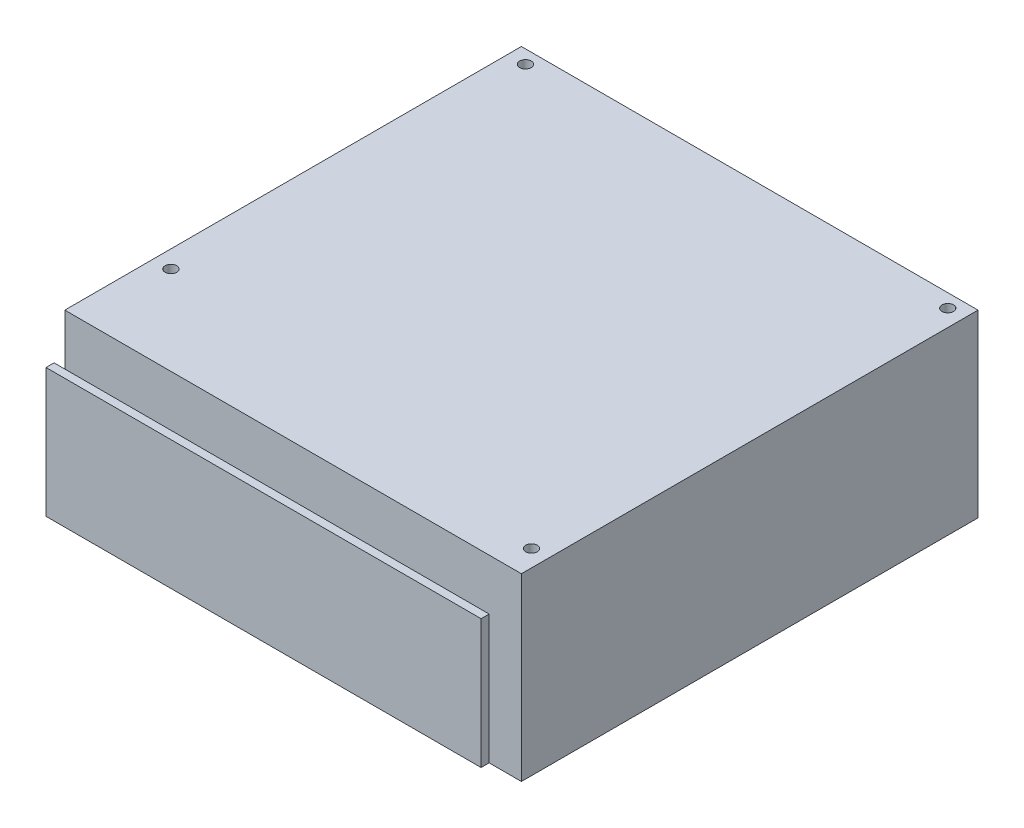
ISO-10303-21;
HEADER;
FILE_DESCRIPTION(('STEP AP214'),'2;1');
FILE_NAME('part.step','',(''),(''),'','','');
FILE_SCHEMA(('AUTOMOTIVE_DESIGN { 1 0 10303 214 1 1 1 1 }'));
ENDSEC;
DATA;
#1=APPLICATION_CONTEXT('core data for automotive mechanical design processes');
#2=APPLICATION_PROTOCOL_DEFINITION('international standard','automotive_design',2000,#1);
#3=PRODUCT_CONTEXT('',#1,'mechanical');
#4=PRODUCT('Part','Part','',(#3));
#5=PRODUCT_RELATED_PRODUCT_CATEGORY('part','',(#4));
#6=PRODUCT_DEFINITION_FORMATION('','',#4);
#7=PRODUCT_DEFINITION_CONTEXT('part definition',#1,'design');
#8=PRODUCT_DEFINITION('design','',#6,#7);
#9=PRODUCT_DEFINITION_SHAPE('','',#8);
#10=(LENGTH_UNIT() NAMED_UNIT(*) SI_UNIT(.MILLI.,.METRE.));
#11=(NAMED_UNIT(*) PLANE_ANGLE_UNIT() SI_UNIT($,.RADIAN.));
#12=(NAMED_UNIT(*) SI_UNIT($,.STERADIAN.) SOLID_ANGLE_UNIT());
#13=UNCERTAINTY_MEASURE_WITH_UNIT(LENGTH_MEASURE(1.E-05),#10,'distance_accuracy_value','');
#14=(GEOMETRIC_REPRESENTATION_CONTEXT(3) GLOBAL_UNCERTAINTY_ASSIGNED_CONTEXT((#13)) GLOBAL_UNIT_ASSIGNED_CONTEXT((#10,
#11,#12)) REPRESENTATION_CONTEXT('',''));
#15=CARTESIAN_POINT('',(0.,0.,0.));
#16=DIRECTION('',(0.,0.,1.));
#17=DIRECTION('',(1.,0.,0.));
#18=AXIS2_PLACEMENT_3D('',#15,#16,#17);
#19=CARTESIAN_POINT('',(-85.,67.,85.));
#20=DIRECTION('',(0.,0.,-1.));
#21=DIRECTION('',(-1.,0.,0.));
#22=AXIS2_PLACEMENT_3D('',#19,#20,#21);
#23=PLANE('',#22);
#24=DIRECTION('',(0.,1.,0.));
#25=VECTOR('',#24,1.);
#26=CARTESIAN_POINT('',(73.,0.,85.));
#27=LINE('',#26,#25);
#28=CARTESIAN_POINT('',(73.,0.,85.));
#29=VERTEX_POINT('',#28);
#30=CARTESIAN_POINT('',(73.,48.,85.));
#31=VERTEX_POINT('',#30);
#32=EDGE_CURVE('E59',#29,#31,#27,.T.);
#33=ORIENTED_EDGE('',*,*,#32,.F.);
#34=DIRECTION('',(1.,0.,0.));
#35=VECTOR('',#34,1.);
#36=CARTESIAN_POINT('',(-85.,0.,85.));
#37=LINE('',#36,#35);
#38=CARTESIAN_POINT('',(85.,0.,85.));
#39=VERTEX_POINT('',#38);
#40=EDGE_CURVE('E140',#29,#39,#37,.T.);
#41=ORIENTED_EDGE('',*,*,#40,.T.);
#42=DIRECTION('',(0.,-1.,0.));
#43=VECTOR('',#42,1.);
#44=CARTESIAN_POINT('',(85.,67.,85.));
#45=LINE('',#44,#43);
#46=CARTESIAN_POINT('',(85.,67.,85.));
#47=VERTEX_POINT('',#46);
#48=EDGE_CURVE('E145',#47,#39,#45,.T.);
#49=ORIENTED_EDGE('',*,*,#48,.F.);
#50=DIRECTION('',(1.,0.,0.));
#51=VECTOR('',#50,1.);
#52=CARTESIAN_POINT('',(-85.,67.,85.));
#53=LINE('',#52,#51);
#54=CARTESIAN_POINT('',(-85.,67.,85.));
#55=VERTEX_POINT('',#54);
#56=EDGE_CURVE('E144',#55,#47,#53,.T.);
#57=ORIENTED_EDGE('',*,*,#56,.F.);
#58=DIRECTION('',(0.,-1.,0.));
#59=VECTOR('',#58,1.);
#60=CARTESIAN_POINT('',(-85.,67.,85.));
#61=LINE('',#60,#59);
#62=CARTESIAN_POINT('',(-85.,48.,85.));
#63=VERTEX_POINT('',#62);
#64=EDGE_CURVE('E154',#55,#63,#61,.T.);
#65=ORIENTED_EDGE('',*,*,#64,.T.);
#66=DIRECTION('',(-1.,0.,0.));
#67=VECTOR('',#66,1.);
#68=CARTESIAN_POINT('',(73.,48.,85.));
#69=LINE('',#68,#67);
#70=EDGE_CURVE('E54',#31,#63,#69,.T.);
#71=ORIENTED_EDGE('',*,*,#70,.F.);
#72=EDGE_LOOP('',(#33,#41,#49,#57,#65,#71));
#73=FACE_BOUND('',#72,.T.);
#74=ADVANCED_FACE('F39',(#73),#23,.F.);
#75=CARTESIAN_POINT('',(85.,67.,85.));
#76=DIRECTION('',(-1.,0.,0.));
#77=DIRECTION('',(0.,0.,1.));
#78=AXIS2_PLACEMENT_3D('',#75,#76,#77);
#79=PLANE('',#78);
#80=DIRECTION('',(0.,0.,-1.));
#81=VECTOR('',#80,1.);
#82=CARTESIAN_POINT('',(85.,0.,85.));
#83=LINE('',#82,#81);
#84=CARTESIAN_POINT('',(85.,0.,-85.));
#85=VERTEX_POINT('',#84);
#86=EDGE_CURVE('E127',#39,#85,#83,.T.);
#87=ORIENTED_EDGE('',*,*,#86,.T.);
#88=DIRECTION('',(0.,-1.,0.));
#89=VECTOR('',#88,1.);
#90=CARTESIAN_POINT('',(85.,67.,-85.));
#91=LINE('',#90,#89);
#92=CARTESIAN_POINT('',(85.,67.,-85.));
#93=VERTEX_POINT('',#92);
#94=EDGE_CURVE('E11',#93,#85,#91,.T.);
#95=ORIENTED_EDGE('',*,*,#94,.F.);
#96=DIRECTION('',(0.,0.,-1.));
#97=VECTOR('',#96,1.);
#98=CARTESIAN_POINT('',(85.,67.,85.));
#99=LINE('',#98,#97);
#100=EDGE_CURVE('E136',#47,#93,#99,.T.);
#101=ORIENTED_EDGE('',*,*,#100,.F.);
#102=ORIENTED_EDGE('',*,*,#48,.T.);
#103=EDGE_LOOP('',(#87,#95,#101,#102));
#104=FACE_BOUND('',#103,.T.);
#105=ADVANCED_FACE('F41',(#104),#79,.F.);
#106=CARTESIAN_POINT('',(-85.,67.,-85.));
#107=DIRECTION('',(0.,0.,1.));
#108=DIRECTION('',(1.,0.,0.));
#109=AXIS2_PLACEMENT_3D('',#106,#107,#108);
#110=PLANE('',#109);
#111=DIRECTION('',(-1.,0.,0.));
#112=VECTOR('',#111,1.);
#113=CARTESIAN_POINT('',(-85.,0.,-85.));
#114=LINE('',#113,#112);
#115=CARTESIAN_POINT('',(-85.,0.,-85.));
#116=VERTEX_POINT('',#115);
#117=EDGE_CURVE('E130',#85,#116,#114,.T.);
#118=ORIENTED_EDGE('',*,*,#117,.T.);
#119=DIRECTION('',(0.,-1.,0.));
#120=VECTOR('',#119,1.);
#121=CARTESIAN_POINT('',(-85.,67.,-85.));
#122=LINE('',#121,#120);
#123=CARTESIAN_POINT('',(-85.,67.,-85.));
#124=VERTEX_POINT('',#123);
#125=EDGE_CURVE('E47',#124,#116,#122,.T.);
#126=ORIENTED_EDGE('',*,*,#125,.F.);
#127=DIRECTION('',(-1.,0.,0.));
#128=VECTOR('',#127,1.);
#129=CARTESIAN_POINT('',(-85.,67.,-85.));
#130=LINE('',#129,#128);
#131=EDGE_CURVE('E139',#93,#124,#130,.T.);
#132=ORIENTED_EDGE('',*,*,#131,.F.);
#133=ORIENTED_EDGE('',*,*,#94,.T.);
#134=EDGE_LOOP('',(#118,#126,#132,#133));
#135=FACE_BOUND('',#134,.T.);
#136=ADVANCED_FACE('F208',(#135),#110,.F.);
#137=CARTESIAN_POINT('',(-85.,67.,85.));
#138=DIRECTION('',(1.,0.,0.));
#139=DIRECTION('',(0.,0.,-1.));
#140=AXIS2_PLACEMENT_3D('',#137,#138,#139);
#141=PLANE('',#140);
#142=DIRECTION('',(0.,0.,1.));
#143=VECTOR('',#142,1.);
#144=CARTESIAN_POINT('',(-85.,0.,85.));
#145=LINE('',#144,#143);
#146=CARTESIAN_POINT('',(-85.,0.,85.));
#147=VERTEX_POINT('',#146);
#148=EDGE_CURVE('E148',#116,#147,#145,.T.);
#149=ORIENTED_EDGE('',*,*,#148,.T.);
#150=EDGE_CURVE('E153',#63,#147,#61,.T.);
#151=ORIENTED_EDGE('',*,*,#150,.F.);
#152=ORIENTED_EDGE('',*,*,#64,.F.);
#153=DIRECTION('',(0.,0.,1.));
#154=VECTOR('',#153,1.);
#155=CARTESIAN_POINT('',(-85.,67.,85.));
#156=LINE('',#155,#154);
#157=EDGE_CURVE('E142',#124,#55,#156,.T.);
#158=ORIENTED_EDGE('',*,*,#157,.F.);
#159=ORIENTED_EDGE('',*,*,#125,.T.);
#160=EDGE_LOOP('',(#149,#151,#152,#158,#159));
#161=FACE_BOUND('',#160,.T.);
#162=ADVANCED_FACE('F160',(#161),#141,.F.);
#163=CARTESIAN_POINT('',(0.,67.,0.));
#164=DIRECTION('',(0.,-1.,0.));
#165=DIRECTION('',(0.,0.,-1.));
#166=AXIS2_PLACEMENT_3D('',#163,#164,#165);
#167=PLANE('',#166);
#168=CARTESIAN_POINT('',(-78.5,67.,-80.));
#169=DIRECTION('',(0.,1.,0.));
#170=DIRECTION('',(0.,0.,1.));
#171=AXIS2_PLACEMENT_3D('',#168,#169,#170);
#172=CIRCLE('',#171,2.15);
#173=CARTESIAN_POINT('',(-78.5,67.,-77.85));
#174=VERTEX_POINT('',#173);
#175=EDGE_CURVE('E256',#174,#174,#172,.T.);
#176=ORIENTED_EDGE('',*,*,#175,.F.);
#177=EDGE_LOOP('',(#176));
#178=FACE_BOUND('',#177,.T.);
#179=CARTESIAN_POINT('',(-78.5,67.,52.));
#180=DIRECTION('',(0.,1.,0.));
#181=DIRECTION('',(0.,0.,1.));
#182=AXIS2_PLACEMENT_3D('',#179,#180,#181);
#183=CIRCLE('',#182,2.15);
#184=CARTESIAN_POINT('',(-78.5,67.,54.15));
#185=VERTEX_POINT('',#184);
#186=EDGE_CURVE('E258',#185,#185,#183,.T.);
#187=ORIENTED_EDGE('',*,*,#186,.F.);
#188=EDGE_LOOP('',(#187));
#189=FACE_BOUND('',#188,.T.);
#190=CARTESIAN_POINT('',(78.7500000000001,67.,75.));
#191=DIRECTION('',(0.,1.,0.));
#192=DIRECTION('',(0.,0.,1.));
#193=AXIS2_PLACEMENT_3D('',#190,#191,#192);
#194=CIRCLE('',#193,2.15);
#195=CARTESIAN_POINT('',(78.7500000000001,67.,77.15));
#196=VERTEX_POINT('',#195);
#197=EDGE_CURVE('E266',#196,#196,#194,.T.);
#198=ORIENTED_EDGE('',*,*,#197,.F.);
#199=EDGE_LOOP('',(#198));
#200=FACE_BOUND('',#199,.T.);
#201=CARTESIAN_POINT('',(78.75,67.,-80.));
#202=DIRECTION('',(0.,1.,0.));
#203=DIRECTION('',(0.,0.,1.));
#204=AXIS2_PLACEMENT_3D('',#201,#202,#203);
#205=CIRCLE('',#204,2.15);
#206=CARTESIAN_POINT('',(78.75,67.,-77.85));
#207=VERTEX_POINT('',#206);
#208=EDGE_CURVE('E272',#207,#207,#205,.T.);
#209=ORIENTED_EDGE('',*,*,#208,.F.);
#210=EDGE_LOOP('',(#209));
#211=FACE_BOUND('',#210,.T.);
#212=ORIENTED_EDGE('',*,*,#100,.T.);
#213=ORIENTED_EDGE('',*,*,#131,.T.);
#214=ORIENTED_EDGE('',*,*,#157,.T.);
#215=ORIENTED_EDGE('',*,*,#56,.T.);
#216=EDGE_LOOP('',(#212,#213,#214,#215));
#217=FACE_BOUND('',#216,.T.);
#218=ADVANCED_FACE('F197',(#178,#189,#200,#211,#217),#167,.F.);
#219=CARTESIAN_POINT('',(0.,0.,0.));
#220=DIRECTION('',(0.,-1.,0.));
#221=DIRECTION('',(0.,0.,-1.));
#222=AXIS2_PLACEMENT_3D('',#219,#220,#221);
#223=PLANE('',#222);
#224=CARTESIAN_POINT('',(-78.5,0.,-80.));
#225=DIRECTION('',(0.,1.,0.));
#226=DIRECTION('',(0.,0.,1.));
#227=AXIS2_PLACEMENT_3D('',#224,#225,#226);
#228=CIRCLE('',#227,2.14999999999999);
#229=CARTESIAN_POINT('',(-78.5,0.,-77.85));
#230=VERTEX_POINT('',#229);
#231=EDGE_CURVE('E254',#230,#230,#228,.T.);
#232=ORIENTED_EDGE('',*,*,#231,.T.);
#233=EDGE_LOOP('',(#232));
#234=FACE_BOUND('',#233,.T.);
#235=CARTESIAN_POINT('',(-78.5,0.,52.));
#236=DIRECTION('',(0.,1.,0.));
#237=DIRECTION('',(0.,0.,1.));
#238=AXIS2_PLACEMENT_3D('',#235,#236,#237);
#239=CIRCLE('',#238,2.14999999999999);
#240=CARTESIAN_POINT('',(-78.5,0.,54.15));
#241=VERTEX_POINT('',#240);
#242=EDGE_CURVE('E263',#241,#241,#239,.T.);
#243=ORIENTED_EDGE('',*,*,#242,.T.);
#244=EDGE_LOOP('',(#243));
#245=FACE_BOUND('',#244,.T.);
#246=CARTESIAN_POINT('',(78.7500000000001,0.,75.));
#247=DIRECTION('',(0.,1.,0.));
#248=DIRECTION('',(0.,0.,1.));
#249=AXIS2_PLACEMENT_3D('',#246,#247,#248);
#250=CIRCLE('',#249,2.14999999999999);
#251=CARTESIAN_POINT('',(78.7500000000001,0.,77.15));
#252=VERTEX_POINT('',#251);
#253=EDGE_CURVE('E269',#252,#252,#250,.T.);
#254=ORIENTED_EDGE('',*,*,#253,.T.);
#255=EDGE_LOOP('',(#254));
#256=FACE_BOUND('',#255,.T.);
#257=CARTESIAN_POINT('',(78.75,0.,-80.));
#258=DIRECTION('',(0.,1.,0.));
#259=DIRECTION('',(0.,0.,1.));
#260=AXIS2_PLACEMENT_3D('',#257,#258,#259);
#261=CIRCLE('',#260,2.14999999999999);
#262=CARTESIAN_POINT('',(78.75,0.,-77.85));
#263=VERTEX_POINT('',#262);
#264=EDGE_CURVE('E184',#263,#263,#261,.T.);
#265=ORIENTED_EDGE('',*,*,#264,.T.);
#266=EDGE_LOOP('',(#265));
#267=FACE_BOUND('',#266,.T.);
#268=ORIENTED_EDGE('',*,*,#86,.F.);
#269=ORIENTED_EDGE('',*,*,#40,.F.);
#270=DIRECTION('',(0.,0.,-1.));
#271=VECTOR('',#270,1.);
#272=CARTESIAN_POINT('',(73.,0.,88.));
#273=LINE('',#272,#271);
#274=CARTESIAN_POINT('',(73.,0.,88.));
#275=VERTEX_POINT('',#274);
#276=EDGE_CURVE('E179',#275,#29,#273,.T.);
#277=ORIENTED_EDGE('',*,*,#276,.F.);
#278=DIRECTION('',(1.,0.,0.));
#279=VECTOR('',#278,1.);
#280=CARTESIAN_POINT('',(73.,0.,88.));
#281=LINE('',#280,#279);
#282=CARTESIAN_POINT('',(-89.,0.,88.));
#283=VERTEX_POINT('',#282);
#284=EDGE_CURVE('E120',#283,#275,#281,.T.);
#285=ORIENTED_EDGE('',*,*,#284,.F.);
#286=DIRECTION('',(0.,0.,-1.));
#287=VECTOR('',#286,1.);
#288=CARTESIAN_POINT('',(-89.,0.,88.));
#289=LINE('',#288,#287);
#290=CARTESIAN_POINT('',(-89.,0.,85.));
#291=VERTEX_POINT('',#290);
#292=EDGE_CURVE('E132',#283,#291,#289,.T.);
#293=ORIENTED_EDGE('',*,*,#292,.T.);
#294=DIRECTION('',(1.,0.,0.));
#295=VECTOR('',#294,1.);
#296=CARTESIAN_POINT('',(73.,0.,85.));
#297=LINE('',#296,#295);
#298=EDGE_CURVE('E124',#291,#147,#297,.T.);
#299=ORIENTED_EDGE('',*,*,#298,.T.);
#300=ORIENTED_EDGE('',*,*,#148,.F.);
#301=ORIENTED_EDGE('',*,*,#117,.F.);
#302=EDGE_LOOP('',(#268,#269,#277,#285,#293,#299,#300,#301));
#303=FACE_BOUND('',#302,.T.);
#304=ADVANCED_FACE('F168',(#234,#245,#256,#267,#303),#223,.T.);
#305=CARTESIAN_POINT('',(0.,0.,85.));
#306=DIRECTION('',(0.,0.,1.));
#307=DIRECTION('',(1.,0.,0.));
#308=AXIS2_PLACEMENT_3D('',#305,#306,#307);
#309=PLANE('',#308);
#310=CARTESIAN_POINT('',(-89.,48.,85.));
#311=VERTEX_POINT('',#310);
#312=EDGE_CURVE('E183',#63,#311,#69,.T.);
#313=ORIENTED_EDGE('',*,*,#312,.F.);
#314=ORIENTED_EDGE('',*,*,#150,.T.);
#315=ORIENTED_EDGE('',*,*,#298,.F.);
#316=DIRECTION('',(0.,-1.,0.));
#317=VECTOR('',#316,1.);
#318=CARTESIAN_POINT('',(-89.,0.,85.));
#319=LINE('',#318,#317);
#320=EDGE_CURVE('E174',#311,#291,#319,.T.);
#321=ORIENTED_EDGE('',*,*,#320,.F.);
#322=EDGE_LOOP('',(#313,#314,#315,#321));
#323=FACE_BOUND('',#322,.T.);
#324=ADVANCED_FACE('F188',(#323),#309,.F.);
#325=CARTESIAN_POINT('',(73.,0.,88.));
#326=DIRECTION('',(-1.,0.,0.));
#327=DIRECTION('',(0.,-1.,0.));
#328=AXIS2_PLACEMENT_3D('',#325,#326,#327);
#329=PLANE('',#328);
#330=ORIENTED_EDGE('',*,*,#32,.T.);
#331=DIRECTION('',(0.,0.,-1.));
#332=VECTOR('',#331,1.);
#333=CARTESIAN_POINT('',(73.,48.,88.));
#334=LINE('',#333,#332);
#335=CARTESIAN_POINT('',(73.,48.,88.));
#336=VERTEX_POINT('',#335);
#337=EDGE_CURVE('E109',#336,#31,#334,.T.);
#338=ORIENTED_EDGE('',*,*,#337,.F.);
#339=DIRECTION('',(0.,1.,0.));
#340=VECTOR('',#339,1.);
#341=CARTESIAN_POINT('',(73.,0.,88.));
#342=LINE('',#341,#340);
#343=EDGE_CURVE('E115',#275,#336,#342,.T.);
#344=ORIENTED_EDGE('',*,*,#343,.F.);
#345=ORIENTED_EDGE('',*,*,#276,.T.);
#346=EDGE_LOOP('',(#330,#338,#344,#345));
#347=FACE_BOUND('',#346,.T.);
#348=ADVANCED_FACE('F126',(#347),#329,.F.);
#349=CARTESIAN_POINT('',(73.,48.,88.));
#350=DIRECTION('',(0.,-1.,0.));
#351=DIRECTION('',(1.,0.,0.));
#352=AXIS2_PLACEMENT_3D('',#349,#350,#351);
#353=PLANE('',#352);
#354=ORIENTED_EDGE('',*,*,#70,.T.);
#355=ORIENTED_EDGE('',*,*,#312,.T.);
#356=DIRECTION('',(0.,0.,-1.));
#357=VECTOR('',#356,1.);
#358=CARTESIAN_POINT('',(-89.,48.,88.));
#359=LINE('',#358,#357);
#360=CARTESIAN_POINT('',(-89.,48.,88.));
#361=VERTEX_POINT('',#360);
#362=EDGE_CURVE('E111',#361,#311,#359,.T.);
#363=ORIENTED_EDGE('',*,*,#362,.F.);
#364=DIRECTION('',(-1.,0.,0.));
#365=VECTOR('',#364,1.);
#366=CARTESIAN_POINT('',(73.,48.,88.));
#367=LINE('',#366,#365);
#368=EDGE_CURVE('E105',#336,#361,#367,.T.);
#369=ORIENTED_EDGE('',*,*,#368,.F.);
#370=ORIENTED_EDGE('',*,*,#337,.T.);
#371=EDGE_LOOP('',(#354,#355,#363,#369,#370));
#372=FACE_BOUND('',#371,.T.);
#373=ADVANCED_FACE('F107',(#372),#353,.F.);
#374=CARTESIAN_POINT('',(-89.,0.,88.));
#375=DIRECTION('',(1.,0.,0.));
#376=DIRECTION('',(0.,0.,-1.));
#377=AXIS2_PLACEMENT_3D('',#374,#375,#376);
#378=PLANE('',#377);
#379=ORIENTED_EDGE('',*,*,#320,.T.);
#380=ORIENTED_EDGE('',*,*,#292,.F.);
#381=DIRECTION('',(0.,-1.,0.));
#382=VECTOR('',#381,1.);
#383=CARTESIAN_POINT('',(-89.,0.,88.));
#384=LINE('',#383,#382);
#385=EDGE_CURVE('E114',#361,#283,#384,.T.);
#386=ORIENTED_EDGE('',*,*,#385,.F.);
#387=ORIENTED_EDGE('',*,*,#362,.T.);
#388=EDGE_LOOP('',(#379,#380,#386,#387));
#389=FACE_BOUND('',#388,.T.);
#390=ADVANCED_FACE('F187',(#389),#378,.F.);
#391=CARTESIAN_POINT('',(0.,0.,88.));
#392=DIRECTION('',(0.,0.,1.));
#393=DIRECTION('',(1.,0.,0.));
#394=AXIS2_PLACEMENT_3D('',#391,#392,#393);
#395=PLANE('',#394);
#396=ORIENTED_EDGE('',*,*,#343,.T.);
#397=ORIENTED_EDGE('',*,*,#368,.T.);
#398=ORIENTED_EDGE('',*,*,#385,.T.);
#399=ORIENTED_EDGE('',*,*,#284,.T.);
#400=EDGE_LOOP('',(#396,#397,#398,#399));
#401=FACE_BOUND('',#400,.T.);
#402=ADVANCED_FACE('F118',(#401),#395,.T.);
#403=CARTESIAN_POINT('',(78.75,67.,-80.));
#404=DIRECTION('',(0.,1.,0.));
#405=DIRECTION('',(0.,0.,1.));
#406=AXIS2_PLACEMENT_3D('',#403,#404,#405);
#407=CYLINDRICAL_SURFACE('',#406,2.14999999999999);
#408=ORIENTED_EDGE('',*,*,#264,.F.);
#409=EDGE_LOOP('',(#408));
#410=FACE_BOUND('',#409,.T.);
#411=ORIENTED_EDGE('',*,*,#208,.T.);
#412=EDGE_LOOP('',(#411));
#413=FACE_BOUND('',#412,.T.);
#414=ADVANCED_FACE('F231',(#410,#413),#407,.F.);
#415=CARTESIAN_POINT('',(78.7500000000001,67.,75.));
#416=DIRECTION('',(0.,1.,0.));
#417=DIRECTION('',(0.,0.,1.));
#418=AXIS2_PLACEMENT_3D('',#415,#416,#417);
#419=CYLINDRICAL_SURFACE('',#418,2.14999999999999);
#420=ORIENTED_EDGE('',*,*,#253,.F.);
#421=EDGE_LOOP('',(#420));
#422=FACE_BOUND('',#421,.T.);
#423=ORIENTED_EDGE('',*,*,#197,.T.);
#424=EDGE_LOOP('',(#423));
#425=FACE_BOUND('',#424,.T.);
#426=ADVANCED_FACE('F235',(#422,#425),#419,.F.);
#427=CARTESIAN_POINT('',(-78.5,67.,52.));
#428=DIRECTION('',(0.,1.,0.));
#429=DIRECTION('',(0.,0.,1.));
#430=AXIS2_PLACEMENT_3D('',#427,#428,#429);
#431=CYLINDRICAL_SURFACE('',#430,2.14999999999999);
#432=ORIENTED_EDGE('',*,*,#242,.F.);
#433=EDGE_LOOP('',(#432));
#434=FACE_BOUND('',#433,.T.);
#435=ORIENTED_EDGE('',*,*,#186,.T.);
#436=EDGE_LOOP('',(#435));
#437=FACE_BOUND('',#436,.T.);
#438=ADVANCED_FACE('F241',(#434,#437),#431,.F.);
#439=CARTESIAN_POINT('',(-78.5,67.,-80.));
#440=DIRECTION('',(0.,1.,0.));
#441=DIRECTION('',(0.,0.,1.));
#442=AXIS2_PLACEMENT_3D('',#439,#440,#441);
#443=CYLINDRICAL_SURFACE('',#442,2.14999999999999);
#444=ORIENTED_EDGE('',*,*,#231,.F.);
#445=EDGE_LOOP('',(#444));
#446=FACE_BOUND('',#445,.T.);
#447=ORIENTED_EDGE('',*,*,#175,.T.);
#448=EDGE_LOOP('',(#447));
#449=FACE_BOUND('',#448,.T.);
#450=ADVANCED_FACE('F245',(#446,#449),#443,.F.);
#451=CLOSED_SHELL('',(#74,#105,#136,#162,#218,#304,#324,#348,#373,#390,#402,#414,#426,#438,#450));
#452=MANIFOLD_SOLID_BREP('B2',#451);
#453=ADVANCED_BREP_SHAPE_REPRESENTATION('',(#18,#452),#14);
#454=SHAPE_DEFINITION_REPRESENTATION(#9,#453);
ENDSEC;
END-ISO-10303-21;
